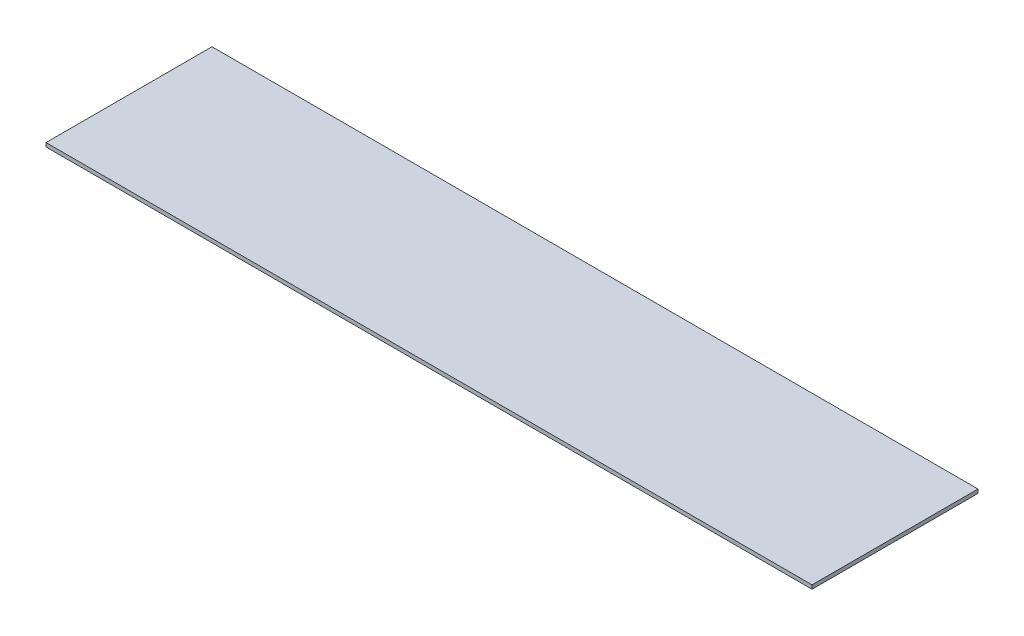
ISO-10303-21;
HEADER;
FILE_DESCRIPTION(('STEP AP214'),'2;1');
FILE_NAME('part.step','',(''),(''),'','','');
FILE_SCHEMA(('AUTOMOTIVE_DESIGN { 1 0 10303 214 1 1 1 1 }'));
ENDSEC;
DATA;
#1=APPLICATION_CONTEXT('core data for automotive mechanical design processes');
#2=APPLICATION_PROTOCOL_DEFINITION('international standard','automotive_design',2000,#1);
#3=PRODUCT_CONTEXT('',#1,'mechanical');
#4=PRODUCT('Part','Part','',(#3));
#5=PRODUCT_RELATED_PRODUCT_CATEGORY('part','',(#4));
#6=PRODUCT_DEFINITION_FORMATION('','',#4);
#7=PRODUCT_DEFINITION_CONTEXT('part definition',#1,'design');
#8=PRODUCT_DEFINITION('design','',#6,#7);
#9=PRODUCT_DEFINITION_SHAPE('','',#8);
#10=(LENGTH_UNIT() NAMED_UNIT(*) SI_UNIT(.MILLI.,.METRE.));
#11=(NAMED_UNIT(*) PLANE_ANGLE_UNIT() SI_UNIT($,.RADIAN.));
#12=(NAMED_UNIT(*) SI_UNIT($,.STERADIAN.) SOLID_ANGLE_UNIT());
#13=UNCERTAINTY_MEASURE_WITH_UNIT(LENGTH_MEASURE(1.E-05),#10,'distance_accuracy_value','');
#14=(GEOMETRIC_REPRESENTATION_CONTEXT(3) GLOBAL_UNCERTAINTY_ASSIGNED_CONTEXT((#13)) GLOBAL_UNIT_ASSIGNED_CONTEXT((#10,
#11,#12)) REPRESENTATION_CONTEXT('',''));
#15=CARTESIAN_POINT('',(0.,0.,0.));
#16=DIRECTION('',(0.,0.,1.));
#17=DIRECTION('',(1.,0.,0.));
#18=AXIS2_PLACEMENT_3D('',#15,#16,#17);
#19=CARTESIAN_POINT('',(0.,1.5,0.));
#20=DIRECTION('',(1.,0.,0.));
#21=DIRECTION('',(0.,0.,-1.));
#22=AXIS2_PLACEMENT_3D('',#19,#20,#21);
#23=PLANE('',#22);
#24=DIRECTION('',(0.,0.,1.));
#25=VECTOR('',#24,1.);
#26=CARTESIAN_POINT('',(0.,0.,0.));
#27=LINE('',#26,#25);
#28=CARTESIAN_POINT('',(0.,0.,-65.));
#29=VERTEX_POINT('',#28);
#30=CARTESIAN_POINT('',(0.,0.,0.));
#31=VERTEX_POINT('',#30);
#32=EDGE_CURVE('E97',#29,#31,#27,.T.);
#33=ORIENTED_EDGE('',*,*,#32,.T.);
#34=DIRECTION('',(0.,-1.,0.));
#35=VECTOR('',#34,1.);
#36=CARTESIAN_POINT('',(0.,1.5,0.));
#37=LINE('',#36,#35);
#38=CARTESIAN_POINT('',(0.,1.5,0.));
#39=VERTEX_POINT('',#38);
#40=EDGE_CURVE('E11',#39,#31,#37,.T.);
#41=ORIENTED_EDGE('',*,*,#40,.F.);
#42=DIRECTION('',(0.,0.,1.));
#43=VECTOR('',#42,1.);
#44=CARTESIAN_POINT('',(0.,1.5,0.));
#45=LINE('',#44,#43);
#46=CARTESIAN_POINT('',(0.,1.5,-65.));
#47=VERTEX_POINT('',#46);
#48=EDGE_CURVE('E85',#47,#39,#45,.T.);
#49=ORIENTED_EDGE('',*,*,#48,.F.);
#50=DIRECTION('',(0.,-1.,0.));
#51=VECTOR('',#50,1.);
#52=CARTESIAN_POINT('',(0.,1.5,-65.));
#53=LINE('',#52,#51);
#54=EDGE_CURVE('E93',#47,#29,#53,.T.);
#55=ORIENTED_EDGE('',*,*,#54,.T.);
#56=EDGE_LOOP('',(#33,#41,#49,#55));
#57=FACE_BOUND('',#56,.T.);
#58=ADVANCED_FACE('F34',(#57),#23,.F.);
#59=CARTESIAN_POINT('',(0.,1.5,0.));
#60=DIRECTION('',(0.,0.,-1.));
#61=DIRECTION('',(-1.,0.,0.));
#62=AXIS2_PLACEMENT_3D('',#59,#60,#61);
#63=PLANE('',#62);
#64=DIRECTION('',(1.,0.,0.));
#65=VECTOR('',#64,1.);
#66=CARTESIAN_POINT('',(0.,0.,0.));
#67=LINE('',#66,#65);
#68=CARTESIAN_POINT('',(300.,0.,0.));
#69=VERTEX_POINT('',#68);
#70=EDGE_CURVE('E89',#31,#69,#67,.T.);
#71=ORIENTED_EDGE('',*,*,#70,.T.);
#72=DIRECTION('',(0.,-1.,0.));
#73=VECTOR('',#72,1.);
#74=CARTESIAN_POINT('',(300.,1.5,0.));
#75=LINE('',#74,#73);
#76=CARTESIAN_POINT('',(300.,1.5,0.));
#77=VERTEX_POINT('',#76);
#78=EDGE_CURVE('E42',#77,#69,#75,.T.);
#79=ORIENTED_EDGE('',*,*,#78,.F.);
#80=DIRECTION('',(1.,0.,0.));
#81=VECTOR('',#80,1.);
#82=CARTESIAN_POINT('',(0.,1.5,0.));
#83=LINE('',#82,#81);
#84=EDGE_CURVE('E80',#39,#77,#83,.T.);
#85=ORIENTED_EDGE('',*,*,#84,.F.);
#86=ORIENTED_EDGE('',*,*,#40,.T.);
#87=EDGE_LOOP('',(#71,#79,#85,#86));
#88=FACE_BOUND('',#87,.T.);
#89=ADVANCED_FACE('F88',(#88),#63,.F.);
#90=CARTESIAN_POINT('',(300.,1.5,0.));
#91=DIRECTION('',(-1.,0.,0.));
#92=DIRECTION('',(0.,0.,1.));
#93=AXIS2_PLACEMENT_3D('',#90,#91,#92);
#94=PLANE('',#93);
#95=DIRECTION('',(0.,0.,-1.));
#96=VECTOR('',#95,1.);
#97=CARTESIAN_POINT('',(300.,0.,0.));
#98=LINE('',#97,#96);
#99=CARTESIAN_POINT('',(300.,0.,-65.));
#100=VERTEX_POINT('',#99);
#101=EDGE_CURVE('E67',#69,#100,#98,.T.);
#102=ORIENTED_EDGE('',*,*,#101,.T.);
#103=DIRECTION('',(0.,-1.,0.));
#104=VECTOR('',#103,1.);
#105=CARTESIAN_POINT('',(300.,1.5,-65.));
#106=LINE('',#105,#104);
#107=CARTESIAN_POINT('',(300.,1.5,-65.));
#108=VERTEX_POINT('',#107);
#109=EDGE_CURVE('E90',#108,#100,#106,.T.);
#110=ORIENTED_EDGE('',*,*,#109,.F.);
#111=DIRECTION('',(0.,0.,-1.));
#112=VECTOR('',#111,1.);
#113=CARTESIAN_POINT('',(300.,1.5,0.));
#114=LINE('',#113,#112);
#115=EDGE_CURVE('E83',#77,#108,#114,.T.);
#116=ORIENTED_EDGE('',*,*,#115,.F.);
#117=ORIENTED_EDGE('',*,*,#78,.T.);
#118=EDGE_LOOP('',(#102,#110,#116,#117));
#119=FACE_BOUND('',#118,.T.);
#120=ADVANCED_FACE('F91',(#119),#94,.F.);
#121=CARTESIAN_POINT('',(0.,1.5,-65.));
#122=DIRECTION('',(0.,0.,1.));
#123=DIRECTION('',(1.,0.,0.));
#124=AXIS2_PLACEMENT_3D('',#121,#122,#123);
#125=PLANE('',#124);
#126=DIRECTION('',(-1.,0.,0.));
#127=VECTOR('',#126,1.);
#128=CARTESIAN_POINT('',(0.,0.,-65.));
#129=LINE('',#128,#127);
#130=EDGE_CURVE('E73',#100,#29,#129,.T.);
#131=ORIENTED_EDGE('',*,*,#130,.T.);
#132=ORIENTED_EDGE('',*,*,#54,.F.);
#133=DIRECTION('',(-1.,0.,0.));
#134=VECTOR('',#133,1.);
#135=CARTESIAN_POINT('',(0.,1.5,-65.));
#136=LINE('',#135,#134);
#137=EDGE_CURVE('E50',#108,#47,#136,.T.);
#138=ORIENTED_EDGE('',*,*,#137,.F.);
#139=ORIENTED_EDGE('',*,*,#109,.T.);
#140=EDGE_LOOP('',(#131,#132,#138,#139));
#141=FACE_BOUND('',#140,.T.);
#142=ADVANCED_FACE('F104',(#141),#125,.F.);
#143=CARTESIAN_POINT('',(0.,1.5,0.));
#144=DIRECTION('',(0.,-1.,0.));
#145=DIRECTION('',(0.,0.,-1.));
#146=AXIS2_PLACEMENT_3D('',#143,#144,#145);
#147=PLANE('',#146);
#148=ORIENTED_EDGE('',*,*,#48,.T.);
#149=ORIENTED_EDGE('',*,*,#84,.T.);
#150=ORIENTED_EDGE('',*,*,#115,.T.);
#151=ORIENTED_EDGE('',*,*,#137,.T.);
#152=EDGE_LOOP('',(#148,#149,#150,#151));
#153=FACE_BOUND('',#152,.T.);
#154=ADVANCED_FACE('F81',(#153),#147,.F.);
#155=CARTESIAN_POINT('',(0.,0.,0.));
#156=DIRECTION('',(0.,-1.,0.));
#157=DIRECTION('',(0.,0.,-1.));
#158=AXIS2_PLACEMENT_3D('',#155,#156,#157);
#159=PLANE('',#158);
#160=ORIENTED_EDGE('',*,*,#32,.F.);
#161=ORIENTED_EDGE('',*,*,#130,.F.);
#162=ORIENTED_EDGE('',*,*,#101,.F.);
#163=ORIENTED_EDGE('',*,*,#70,.F.);
#164=EDGE_LOOP('',(#160,#161,#162,#163));
#165=FACE_BOUND('',#164,.T.);
#166=ADVANCED_FACE('F107',(#165),#159,.T.);
#167=CLOSED_SHELL('',(#58,#89,#120,#142,#154,#166));
#168=MANIFOLD_SOLID_BREP('B2',#167);
#169=ADVANCED_BREP_SHAPE_REPRESENTATION('',(#18,#168),#14);
#170=SHAPE_DEFINITION_REPRESENTATION(#9,#169);
ENDSEC;
END-ISO-10303-21;
